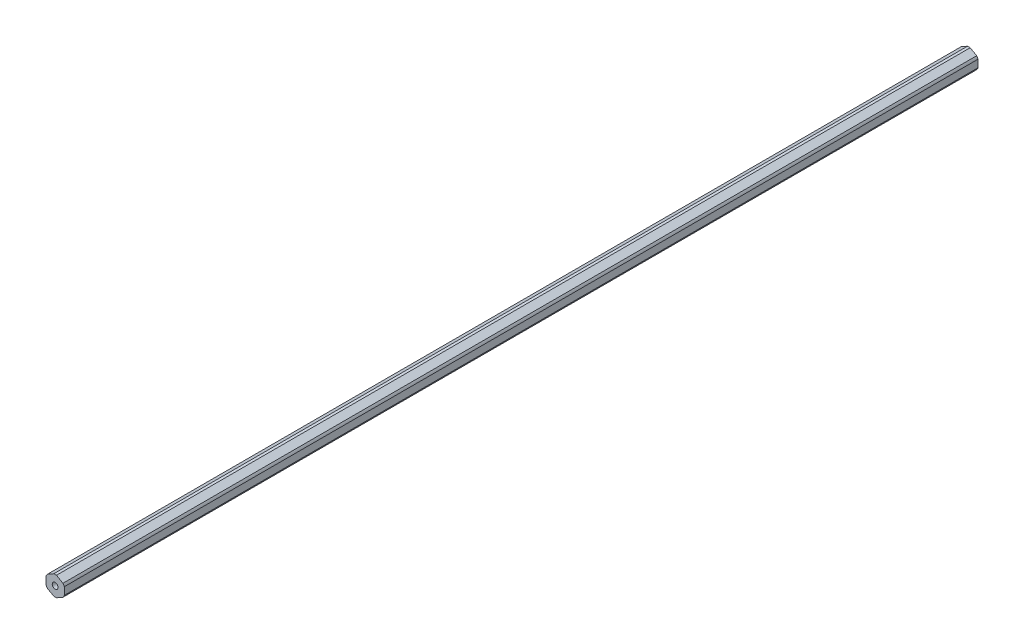
ISO-10303-21;
HEADER;
FILE_DESCRIPTION(('STEP AP214'),'2;1');
FILE_NAME('part.step','',(''),(''),'','','');
FILE_SCHEMA(('AUTOMOTIVE_DESIGN { 1 0 10303 214 1 1 1 1 }'));
ENDSEC;
DATA;
#1=APPLICATION_CONTEXT('core data for automotive mechanical design processes');
#2=APPLICATION_PROTOCOL_DEFINITION('international standard','automotive_design',2000,#1);
#3=PRODUCT_CONTEXT('',#1,'mechanical');
#4=PRODUCT('Part','Part','',(#3));
#5=PRODUCT_RELATED_PRODUCT_CATEGORY('part','',(#4));
#6=PRODUCT_DEFINITION_FORMATION('','',#4);
#7=PRODUCT_DEFINITION_CONTEXT('part definition',#1,'design');
#8=PRODUCT_DEFINITION('design','',#6,#7);
#9=PRODUCT_DEFINITION_SHAPE('','',#8);
#10=(LENGTH_UNIT() NAMED_UNIT(*) SI_UNIT(.MILLI.,.METRE.));
#11=(NAMED_UNIT(*) PLANE_ANGLE_UNIT() SI_UNIT($,.RADIAN.));
#12=(NAMED_UNIT(*) SI_UNIT($,.STERADIAN.) SOLID_ANGLE_UNIT());
#13=UNCERTAINTY_MEASURE_WITH_UNIT(LENGTH_MEASURE(1.E-05),#10,'distance_accuracy_value','');
#14=(GEOMETRIC_REPRESENTATION_CONTEXT(3) GLOBAL_UNCERTAINTY_ASSIGNED_CONTEXT((#13)) GLOBAL_UNIT_ASSIGNED_CONTEXT((#10,
#11,#12)) REPRESENTATION_CONTEXT('',''));
#15=CARTESIAN_POINT('',(0.,0.,0.));
#16=DIRECTION('',(0.,0.,1.));
#17=DIRECTION('',(1.,0.,0.));
#18=AXIS2_PLACEMENT_3D('',#15,#16,#17);
#19=CARTESIAN_POINT('',(6.35,0.,317.5));
#20=DIRECTION('',(-1.,0.,0.));
#21=DIRECTION('',(0.,0.,1.));
#22=AXIS2_PLACEMENT_3D('',#19,#20,#21);
#23=PLANE('',#22);
#24=DIRECTION('',(0.,1.,0.));
#25=VECTOR('',#24,1.);
#26=CARTESIAN_POINT('',(6.35,0.,-317.5));
#27=LINE('',#26,#25);
#28=CARTESIAN_POINT('',(6.35,-2.59030191290514,-317.5));
#29=VERTEX_POINT('',#28);
#30=CARTESIAN_POINT('',(6.35,2.59030191290514,-317.5));
#31=VERTEX_POINT('',#30);
#32=EDGE_CURVE('E187',#29,#31,#27,.T.);
#33=ORIENTED_EDGE('',*,*,#32,.T.);
#34=DIRECTION('',(0.,0.,-1.));
#35=VECTOR('',#34,1.);
#36=CARTESIAN_POINT('',(6.35,2.59030191290514,317.5));
#37=LINE('',#36,#35);
#38=CARTESIAN_POINT('',(6.35,2.59030191290514,317.5));
#39=VERTEX_POINT('',#38);
#40=EDGE_CURVE('E11',#39,#31,#37,.T.);
#41=ORIENTED_EDGE('',*,*,#40,.F.);
#42=DIRECTION('',(0.,1.,0.));
#43=VECTOR('',#42,1.);
#44=CARTESIAN_POINT('',(6.35,0.,317.5));
#45=LINE('',#44,#43);
#46=CARTESIAN_POINT('',(6.35,-2.59030191290514,317.5));
#47=VERTEX_POINT('',#46);
#48=EDGE_CURVE('E267',#47,#39,#45,.T.);
#49=ORIENTED_EDGE('',*,*,#48,.F.);
#50=DIRECTION('',(0.,0.,-1.));
#51=VECTOR('',#50,1.);
#52=CARTESIAN_POINT('',(6.35,-2.59030191290514,317.5));
#53=LINE('',#52,#51);
#54=EDGE_CURVE('E183',#47,#29,#53,.T.);
#55=ORIENTED_EDGE('',*,*,#54,.T.);
#56=EDGE_LOOP('',(#33,#41,#49,#55));
#57=FACE_BOUND('',#56,.T.);
#58=ADVANCED_FACE('F58',(#57),#23,.F.);
#59=CARTESIAN_POINT('',(0.,0.,317.5));
#60=DIRECTION('',(0.,0.,-1.));
#61=DIRECTION('',(-1.,0.,0.));
#62=AXIS2_PLACEMENT_3D('',#59,#60,#61);
#63=CYLINDRICAL_SURFACE('',#62,6.858);
#64=CARTESIAN_POINT('',(0.,0.,-317.5));
#65=DIRECTION('',(0.,0.,1.));
#66=DIRECTION('',(1.,0.,0.));
#67=AXIS2_PLACEMENT_3D('',#64,#65,#66);
#68=CIRCLE('',#67,6.858);
#69=CARTESIAN_POINT('',(5.41826726004728,4.20411035757862,-317.5));
#70=VERTEX_POINT('',#69);
#71=EDGE_CURVE('E191',#31,#70,#68,.T.);
#72=ORIENTED_EDGE('',*,*,#71,.T.);
#73=DIRECTION('',(0.,0.,-1.));
#74=VECTOR('',#73,1.);
#75=CARTESIAN_POINT('',(5.41826726004728,4.20411035757862,317.5));
#76=LINE('',#75,#74);
#77=CARTESIAN_POINT('',(5.41826726004728,4.20411035757862,317.5));
#78=VERTEX_POINT('',#77);
#79=EDGE_CURVE('E67',#78,#70,#76,.T.);
#80=ORIENTED_EDGE('',*,*,#79,.F.);
#81=CARTESIAN_POINT('',(0.,0.,317.5));
#82=DIRECTION('',(0.,0.,1.));
#83=DIRECTION('',(1.,0.,0.));
#84=AXIS2_PLACEMENT_3D('',#81,#82,#83);
#85=CIRCLE('',#84,6.858);
#86=EDGE_CURVE('E131',#39,#78,#85,.T.);
#87=ORIENTED_EDGE('',*,*,#86,.F.);
#88=ORIENTED_EDGE('',*,*,#40,.T.);
#89=EDGE_LOOP('',(#72,#80,#87,#88));
#90=FACE_BOUND('',#89,.T.);
#91=ADVANCED_FACE('F310',(#90),#63,.T.);
#92=CARTESIAN_POINT('',(3.175,5.49926131403118,317.5));
#93=DIRECTION('',(-0.5,-0.866025403784439,0.));
#94=DIRECTION('',(0.866025403784439,-0.5,0.));
#95=AXIS2_PLACEMENT_3D('',#92,#93,#94);
#96=PLANE('',#95);
#97=DIRECTION('',(-0.866025403784439,0.5,0.));
#98=VECTOR('',#97,1.);
#99=CARTESIAN_POINT('',(3.175,5.49926131403118,-317.5));
#100=LINE('',#99,#98);
#101=CARTESIAN_POINT('',(0.931732739952727,6.79441227048375,-317.5));
#102=VERTEX_POINT('',#101);
#103=EDGE_CURVE('E195',#70,#102,#100,.T.);
#104=ORIENTED_EDGE('',*,*,#103,.T.);
#105=DIRECTION('',(0.,0.,-1.));
#106=VECTOR('',#105,1.);
#107=CARTESIAN_POINT('',(0.931732739952727,6.79441227048375,317.5));
#108=LINE('',#107,#106);
#109=CARTESIAN_POINT('',(0.931732739952727,6.79441227048375,317.5));
#110=VERTEX_POINT('',#109);
#111=EDGE_CURVE('E238',#110,#102,#108,.T.);
#112=ORIENTED_EDGE('',*,*,#111,.F.);
#113=DIRECTION('',(-0.866025403784439,0.5,0.));
#114=VECTOR('',#113,1.);
#115=CARTESIAN_POINT('',(3.175,5.49926131403118,317.5));
#116=LINE('',#115,#114);
#117=EDGE_CURVE('E248',#78,#110,#116,.T.);
#118=ORIENTED_EDGE('',*,*,#117,.F.);
#119=ORIENTED_EDGE('',*,*,#79,.T.);
#120=EDGE_LOOP('',(#104,#112,#118,#119));
#121=FACE_BOUND('',#120,.T.);
#122=ADVANCED_FACE('F246',(#121),#96,.F.);
#123=CARTESIAN_POINT('',(-0.931732739952726,6.79441227048375,-317.5));
#124=VERTEX_POINT('',#123);
#125=EDGE_CURVE('E196',#102,#124,#68,.T.);
#126=ORIENTED_EDGE('',*,*,#125,.T.);
#127=DIRECTION('',(0.,0.,-1.));
#128=VECTOR('',#127,1.);
#129=CARTESIAN_POINT('',(-0.931732739952726,6.79441227048375,317.5));
#130=LINE('',#129,#128);
#131=CARTESIAN_POINT('',(-0.931732739952726,6.79441227048375,317.5));
#132=VERTEX_POINT('',#131);
#133=EDGE_CURVE('E234',#132,#124,#130,.T.);
#134=ORIENTED_EDGE('',*,*,#133,.F.);
#135=EDGE_CURVE('E273',#110,#132,#85,.T.);
#136=ORIENTED_EDGE('',*,*,#135,.F.);
#137=ORIENTED_EDGE('',*,*,#111,.T.);
#138=EDGE_LOOP('',(#126,#134,#136,#137));
#139=FACE_BOUND('',#138,.T.);
#140=ADVANCED_FACE('F293',(#139),#63,.T.);
#141=CARTESIAN_POINT('',(-3.175,5.49926131403119,317.5));
#142=DIRECTION('',(0.5,-0.866025403784439,0.));
#143=DIRECTION('',(0.866025403784439,0.5,0.));
#144=AXIS2_PLACEMENT_3D('',#141,#142,#143);
#145=PLANE('',#144);
#146=DIRECTION('',(-0.866025403784439,-0.5,0.));
#147=VECTOR('',#146,1.);
#148=CARTESIAN_POINT('',(-3.175,5.49926131403119,-317.5));
#149=LINE('',#148,#147);
#150=CARTESIAN_POINT('',(-5.41826726004727,4.20411035757862,-317.5));
#151=VERTEX_POINT('',#150);
#152=EDGE_CURVE('E199',#124,#151,#149,.T.);
#153=ORIENTED_EDGE('',*,*,#152,.T.);
#154=DIRECTION('',(0.,0.,-1.));
#155=VECTOR('',#154,1.);
#156=CARTESIAN_POINT('',(-5.41826726004727,4.20411035757862,317.5));
#157=LINE('',#156,#155);
#158=CARTESIAN_POINT('',(-5.41826726004727,4.20411035757862,317.5));
#159=VERTEX_POINT('',#158);
#160=EDGE_CURVE('E230',#159,#151,#157,.T.);
#161=ORIENTED_EDGE('',*,*,#160,.F.);
#162=DIRECTION('',(-0.866025403784439,-0.5,0.));
#163=VECTOR('',#162,1.);
#164=CARTESIAN_POINT('',(-3.175,5.49926131403119,317.5));
#165=LINE('',#164,#163);
#166=EDGE_CURVE('E279',#132,#159,#165,.T.);
#167=ORIENTED_EDGE('',*,*,#166,.F.);
#168=ORIENTED_EDGE('',*,*,#133,.T.);
#169=EDGE_LOOP('',(#153,#161,#167,#168));
#170=FACE_BOUND('',#169,.T.);
#171=ADVANCED_FACE('F295',(#170),#145,.F.);
#172=CARTESIAN_POINT('',(-6.35,2.59030191290514,-317.5));
#173=VERTEX_POINT('',#172);
#174=EDGE_CURVE('E202',#151,#173,#68,.T.);
#175=ORIENTED_EDGE('',*,*,#174,.T.);
#176=DIRECTION('',(0.,0.,-1.));
#177=VECTOR('',#176,1.);
#178=CARTESIAN_POINT('',(-6.35,2.59030191290514,317.5));
#179=LINE('',#178,#177);
#180=CARTESIAN_POINT('',(-6.35,2.59030191290514,317.5));
#181=VERTEX_POINT('',#180);
#182=EDGE_CURVE('E226',#181,#173,#179,.T.);
#183=ORIENTED_EDGE('',*,*,#182,.F.);
#184=EDGE_CURVE('E281',#159,#181,#85,.T.);
#185=ORIENTED_EDGE('',*,*,#184,.F.);
#186=ORIENTED_EDGE('',*,*,#160,.T.);
#187=EDGE_LOOP('',(#175,#183,#185,#186));
#188=FACE_BOUND('',#187,.T.);
#189=ADVANCED_FACE('F296',(#188),#63,.T.);
#190=CARTESIAN_POINT('',(-6.35,0.,317.5));
#191=DIRECTION('',(1.,0.,0.));
#192=DIRECTION('',(0.,1.,0.));
#193=AXIS2_PLACEMENT_3D('',#190,#191,#192);
#194=PLANE('',#193);
#195=DIRECTION('',(0.,-1.,0.));
#196=VECTOR('',#195,1.);
#197=CARTESIAN_POINT('',(-6.35,0.,-317.5));
#198=LINE('',#197,#196);
#199=CARTESIAN_POINT('',(-6.35,-2.59030191290514,-317.5));
#200=VERTEX_POINT('',#199);
#201=EDGE_CURVE('E203',#173,#200,#198,.T.);
#202=ORIENTED_EDGE('',*,*,#201,.T.);
#203=DIRECTION('',(0.,0.,-1.));
#204=VECTOR('',#203,1.);
#205=CARTESIAN_POINT('',(-6.35,-2.59030191290514,317.5));
#206=LINE('',#205,#204);
#207=CARTESIAN_POINT('',(-6.35,-2.59030191290514,317.5));
#208=VERTEX_POINT('',#207);
#209=EDGE_CURVE('E222',#208,#200,#206,.T.);
#210=ORIENTED_EDGE('',*,*,#209,.F.);
#211=DIRECTION('',(0.,-1.,0.));
#212=VECTOR('',#211,1.);
#213=CARTESIAN_POINT('',(-6.35,0.,317.5));
#214=LINE('',#213,#212);
#215=EDGE_CURVE('E282',#181,#208,#214,.T.);
#216=ORIENTED_EDGE('',*,*,#215,.F.);
#217=ORIENTED_EDGE('',*,*,#182,.T.);
#218=EDGE_LOOP('',(#202,#210,#216,#217));
#219=FACE_BOUND('',#218,.T.);
#220=ADVANCED_FACE('F299',(#219),#194,.F.);
#221=CARTESIAN_POINT('',(-5.41826726004728,-4.20411035757861,-317.5));
#222=VERTEX_POINT('',#221);
#223=EDGE_CURVE('E206',#200,#222,#68,.T.);
#224=ORIENTED_EDGE('',*,*,#223,.T.);
#225=DIRECTION('',(0.,0.,-1.));
#226=VECTOR('',#225,1.);
#227=CARTESIAN_POINT('',(-5.41826726004728,-4.20411035757861,317.5));
#228=LINE('',#227,#226);
#229=CARTESIAN_POINT('',(-5.41826726004728,-4.20411035757861,317.5));
#230=VERTEX_POINT('',#229);
#231=EDGE_CURVE('E218',#230,#222,#228,.T.);
#232=ORIENTED_EDGE('',*,*,#231,.F.);
#233=EDGE_CURVE('E170',#208,#230,#85,.T.);
#234=ORIENTED_EDGE('',*,*,#233,.F.);
#235=ORIENTED_EDGE('',*,*,#209,.T.);
#236=EDGE_LOOP('',(#224,#232,#234,#235));
#237=FACE_BOUND('',#236,.T.);
#238=ADVANCED_FACE('F301',(#237),#63,.T.);
#239=CARTESIAN_POINT('',(-3.175,-5.49926131403118,317.5));
#240=DIRECTION('',(0.5,0.866025403784439,0.));
#241=DIRECTION('',(-0.866025403784439,0.5,0.));
#242=AXIS2_PLACEMENT_3D('',#239,#240,#241);
#243=PLANE('',#242);
#244=DIRECTION('',(0.866025403784439,-0.5,0.));
#245=VECTOR('',#244,1.);
#246=CARTESIAN_POINT('',(-3.175,-5.49926131403118,-317.5));
#247=LINE('',#246,#245);
#248=CARTESIAN_POINT('',(-0.931732739952714,-6.79441227048375,-317.5));
#249=VERTEX_POINT('',#248);
#250=EDGE_CURVE('E207',#222,#249,#247,.T.);
#251=ORIENTED_EDGE('',*,*,#250,.T.);
#252=DIRECTION('',(0.,0.,-1.));
#253=VECTOR('',#252,1.);
#254=CARTESIAN_POINT('',(-0.931732739952714,-6.79441227048375,317.5));
#255=LINE('',#254,#253);
#256=CARTESIAN_POINT('',(-0.931732739952714,-6.79441227048375,317.5));
#257=VERTEX_POINT('',#256);
#258=EDGE_CURVE('E176',#257,#249,#255,.T.);
#259=ORIENTED_EDGE('',*,*,#258,.F.);
#260=DIRECTION('',(0.866025403784439,-0.5,0.));
#261=VECTOR('',#260,1.);
#262=CARTESIAN_POINT('',(-3.175,-5.49926131403118,317.5));
#263=LINE('',#262,#261);
#264=EDGE_CURVE('E164',#230,#257,#263,.T.);
#265=ORIENTED_EDGE('',*,*,#264,.F.);
#266=ORIENTED_EDGE('',*,*,#231,.T.);
#267=EDGE_LOOP('',(#251,#259,#265,#266));
#268=FACE_BOUND('',#267,.T.);
#269=ADVANCED_FACE('F304',(#268),#243,.F.);
#270=CARTESIAN_POINT('',(0.931732739952726,-6.79441227048375,-317.5));
#271=VERTEX_POINT('',#270);
#272=EDGE_CURVE('E174',#249,#271,#68,.T.);
#273=ORIENTED_EDGE('',*,*,#272,.T.);
#274=DIRECTION('',(0.,0.,-1.));
#275=VECTOR('',#274,1.);
#276=CARTESIAN_POINT('',(0.931732739952726,-6.79441227048375,317.5));
#277=LINE('',#276,#275);
#278=CARTESIAN_POINT('',(0.931732739952726,-6.79441227048375,317.5));
#279=VERTEX_POINT('',#278);
#280=EDGE_CURVE('E171',#279,#271,#277,.T.);
#281=ORIENTED_EDGE('',*,*,#280,.F.);
#282=EDGE_CURVE('E158',#257,#279,#85,.T.);
#283=ORIENTED_EDGE('',*,*,#282,.F.);
#284=ORIENTED_EDGE('',*,*,#258,.T.);
#285=EDGE_LOOP('',(#273,#281,#283,#284));
#286=FACE_BOUND('',#285,.T.);
#287=ADVANCED_FACE('F172',(#286),#63,.T.);
#288=CARTESIAN_POINT('',(3.175,-5.49926131403118,317.5));
#289=DIRECTION('',(-0.5,0.866025403784439,0.));
#290=DIRECTION('',(-0.866025403784439,-0.5,0.));
#291=AXIS2_PLACEMENT_3D('',#288,#289,#290);
#292=PLANE('',#291);
#293=DIRECTION('',(0.866025403784439,0.5,0.));
#294=VECTOR('',#293,1.);
#295=CARTESIAN_POINT('',(3.175,-5.49926131403118,-317.5));
#296=LINE('',#295,#294);
#297=CARTESIAN_POINT('',(5.41826726004728,-4.20411035757862,-317.5));
#298=VERTEX_POINT('',#297);
#299=EDGE_CURVE('E117',#271,#298,#296,.T.);
#300=ORIENTED_EDGE('',*,*,#299,.T.);
#301=DIRECTION('',(0.,0.,-1.));
#302=VECTOR('',#301,1.);
#303=CARTESIAN_POINT('',(5.41826726004728,-4.20411035757862,317.5));
#304=LINE('',#303,#302);
#305=CARTESIAN_POINT('',(5.41826726004728,-4.20411035757862,317.5));
#306=VERTEX_POINT('',#305);
#307=EDGE_CURVE('E177',#306,#298,#304,.T.);
#308=ORIENTED_EDGE('',*,*,#307,.F.);
#309=DIRECTION('',(0.866025403784439,0.5,0.));
#310=VECTOR('',#309,1.);
#311=CARTESIAN_POINT('',(3.175,-5.49926131403118,317.5));
#312=LINE('',#311,#310);
#313=EDGE_CURVE('E162',#279,#306,#312,.T.);
#314=ORIENTED_EDGE('',*,*,#313,.F.);
#315=ORIENTED_EDGE('',*,*,#280,.T.);
#316=EDGE_LOOP('',(#300,#308,#314,#315));
#317=FACE_BOUND('',#316,.T.);
#318=ADVANCED_FACE('F179',(#317),#292,.F.);
#319=EDGE_CURVE('E123',#298,#29,#68,.T.);
#320=ORIENTED_EDGE('',*,*,#319,.T.);
#321=ORIENTED_EDGE('',*,*,#54,.F.);
#322=EDGE_CURVE('E75',#306,#47,#85,.T.);
#323=ORIENTED_EDGE('',*,*,#322,.F.);
#324=ORIENTED_EDGE('',*,*,#307,.T.);
#325=EDGE_LOOP('',(#320,#321,#323,#324));
#326=FACE_BOUND('',#325,.T.);
#327=ADVANCED_FACE('F307',(#326),#63,.T.);
#328=CARTESIAN_POINT('',(0.,0.,317.5));
#329=DIRECTION('',(0.,0.,1.));
#330=DIRECTION('',(1.,0.,0.));
#331=AXIS2_PLACEMENT_3D('',#328,#329,#330);
#332=PLANE('',#331);
#333=CARTESIAN_POINT('',(0.,0.,317.5));
#334=DIRECTION('',(0.,0.,1.));
#335=DIRECTION('',(1.,0.,0.));
#336=AXIS2_PLACEMENT_3D('',#333,#334,#335);
#337=CIRCLE('',#336,2.01929999999999);
#338=CARTESIAN_POINT('',(2.01929999999999,0.,317.5));
#339=VERTEX_POINT('',#338);
#340=EDGE_CURVE('E476',#339,#339,#337,.T.);
#341=ORIENTED_EDGE('',*,*,#340,.F.);
#342=EDGE_LOOP('',(#341));
#343=FACE_BOUND('',#342,.T.);
#344=ORIENTED_EDGE('',*,*,#48,.T.);
#345=ORIENTED_EDGE('',*,*,#86,.T.);
#346=ORIENTED_EDGE('',*,*,#117,.T.);
#347=ORIENTED_EDGE('',*,*,#135,.T.);
#348=ORIENTED_EDGE('',*,*,#166,.T.);
#349=ORIENTED_EDGE('',*,*,#184,.T.);
#350=ORIENTED_EDGE('',*,*,#215,.T.);
#351=ORIENTED_EDGE('',*,*,#233,.T.);
#352=ORIENTED_EDGE('',*,*,#264,.T.);
#353=ORIENTED_EDGE('',*,*,#282,.T.);
#354=ORIENTED_EDGE('',*,*,#313,.T.);
#355=ORIENTED_EDGE('',*,*,#322,.T.);
#356=EDGE_LOOP('',(#344,#345,#346,#347,#348,#349,#350,#351,#352,#353,#354,#355));
#357=FACE_BOUND('',#356,.T.);
#358=ADVANCED_FACE('F160',(#343,#357),#332,.T.);
#359=CARTESIAN_POINT('',(0.,0.,-317.5));
#360=DIRECTION('',(0.,0.,1.));
#361=DIRECTION('',(1.,0.,0.));
#362=AXIS2_PLACEMENT_3D('',#359,#360,#361);
#363=PLANE('',#362);
#364=CARTESIAN_POINT('',(0.,0.,-317.5));
#365=DIRECTION('',(0.,0.,-1.));
#366=DIRECTION('',(-1.,0.,0.));
#367=AXIS2_PLACEMENT_3D('',#364,#365,#366);
#368=CIRCLE('',#367,2.01929999999999);
#369=CARTESIAN_POINT('',(-2.01929999999999,0.,-317.5));
#370=VERTEX_POINT('',#369);
#371=EDGE_CURVE('E480',#370,#370,#368,.T.);
#372=ORIENTED_EDGE('',*,*,#371,.F.);
#373=EDGE_LOOP('',(#372));
#374=FACE_BOUND('',#373,.T.);
#375=ORIENTED_EDGE('',*,*,#32,.F.);
#376=ORIENTED_EDGE('',*,*,#319,.F.);
#377=ORIENTED_EDGE('',*,*,#299,.F.);
#378=ORIENTED_EDGE('',*,*,#272,.F.);
#379=ORIENTED_EDGE('',*,*,#250,.F.);
#380=ORIENTED_EDGE('',*,*,#223,.F.);
#381=ORIENTED_EDGE('',*,*,#201,.F.);
#382=ORIENTED_EDGE('',*,*,#174,.F.);
#383=ORIENTED_EDGE('',*,*,#152,.F.);
#384=ORIENTED_EDGE('',*,*,#125,.F.);
#385=ORIENTED_EDGE('',*,*,#103,.F.);
#386=ORIENTED_EDGE('',*,*,#71,.F.);
#387=EDGE_LOOP('',(#375,#376,#377,#378,#379,#380,#381,#382,#383,#384,#385,#386));
#388=FACE_BOUND('',#387,.T.);
#389=ADVANCED_FACE('F252',(#374,#388),#363,.F.);
#390=CARTESIAN_POINT('',(0.,0.,-305.562));
#391=DIRECTION('',(0.,0.,-1.));
#392=DIRECTION('',(-1.,0.,0.));
#393=AXIS2_PLACEMENT_3D('',#390,#391,#392);
#394=CONICAL_SURFACE('',#393,2.01929999999999,1.02974425867666);
#395=CARTESIAN_POINT('',(0.,0.,-304.348682151998));
#396=VERTEX_POINT('',#395);
#397=VERTEX_LOOP('',#396);
#398=FACE_BOUND('',#397,.T.);
#399=CARTESIAN_POINT('',(0.,0.,-305.562));
#400=DIRECTION('',(0.,0.,-1.));
#401=DIRECTION('',(-1.,0.,0.));
#402=AXIS2_PLACEMENT_3D('',#399,#400,#401);
#403=CIRCLE('',#402,2.01929999999999);
#404=CARTESIAN_POINT('',(-2.01929999999999,0.,-305.562));
#405=VERTEX_POINT('',#404);
#406=EDGE_CURVE('E192',#405,#405,#403,.T.);
#407=ORIENTED_EDGE('',*,*,#406,.T.);
#408=EDGE_LOOP('',(#407));
#409=FACE_BOUND('',#408,.T.);
#410=ADVANCED_FACE('F406',(#398,#409),#394,.F.);
#411=CARTESIAN_POINT('',(0.,0.,-317.5));
#412=DIRECTION('',(0.,0.,-1.));
#413=DIRECTION('',(-1.,0.,0.));
#414=AXIS2_PLACEMENT_3D('',#411,#412,#413);
#415=CYLINDRICAL_SURFACE('',#414,2.01929999999999);
#416=ORIENTED_EDGE('',*,*,#406,.F.);
#417=EDGE_LOOP('',(#416));
#418=FACE_BOUND('',#417,.T.);
#419=ORIENTED_EDGE('',*,*,#371,.T.);
#420=EDGE_LOOP('',(#419));
#421=FACE_BOUND('',#420,.T.);
#422=ADVANCED_FACE('F415',(#418,#421),#415,.F.);
#423=CARTESIAN_POINT('',(0.,0.,305.562));
#424=DIRECTION('',(0.,0.,1.));
#425=DIRECTION('',(1.,0.,0.));
#426=AXIS2_PLACEMENT_3D('',#423,#424,#425);
#427=CONICAL_SURFACE('',#426,2.01929999999999,1.02974425867666);
#428=CARTESIAN_POINT('',(0.,0.,304.348682151998));
#429=VERTEX_POINT('',#428);
#430=VERTEX_LOOP('',#429);
#431=FACE_BOUND('',#430,.T.);
#432=CARTESIAN_POINT('',(0.,0.,305.562));
#433=DIRECTION('',(0.,0.,1.));
#434=DIRECTION('',(1.,0.,0.));
#435=AXIS2_PLACEMENT_3D('',#432,#433,#434);
#436=CIRCLE('',#435,2.01929999999999);
#437=CARTESIAN_POINT('',(2.01929999999999,0.,305.562));
#438=VERTEX_POINT('',#437);
#439=EDGE_CURVE('E473',#438,#438,#436,.T.);
#440=ORIENTED_EDGE('',*,*,#439,.T.);
#441=EDGE_LOOP('',(#440));
#442=FACE_BOUND('',#441,.T.);
#443=ADVANCED_FACE('F426',(#431,#442),#427,.F.);
#444=CARTESIAN_POINT('',(0.,0.,317.5));
#445=DIRECTION('',(0.,0.,1.));
#446=DIRECTION('',(1.,0.,0.));
#447=AXIS2_PLACEMENT_3D('',#444,#445,#446);
#448=CYLINDRICAL_SURFACE('',#447,2.01929999999999);
#449=ORIENTED_EDGE('',*,*,#439,.F.);
#450=EDGE_LOOP('',(#449));
#451=FACE_BOUND('',#450,.T.);
#452=ORIENTED_EDGE('',*,*,#340,.T.);
#453=EDGE_LOOP('',(#452));
#454=FACE_BOUND('',#453,.T.);
#455=ADVANCED_FACE('F437',(#451,#454),#448,.F.);
#456=CLOSED_SHELL('',(#58,#91,#122,#140,#171,#189,#220,#238,#269,#287,#318,#327,#358,#389,#410,
#422,#443,#455));
#457=MANIFOLD_SOLID_BREP('B2',#456);
#458=ADVANCED_BREP_SHAPE_REPRESENTATION('',(#18,#457),#14);
#459=SHAPE_DEFINITION_REPRESENTATION(#9,#458);
ENDSEC;
END-ISO-10303-21;
